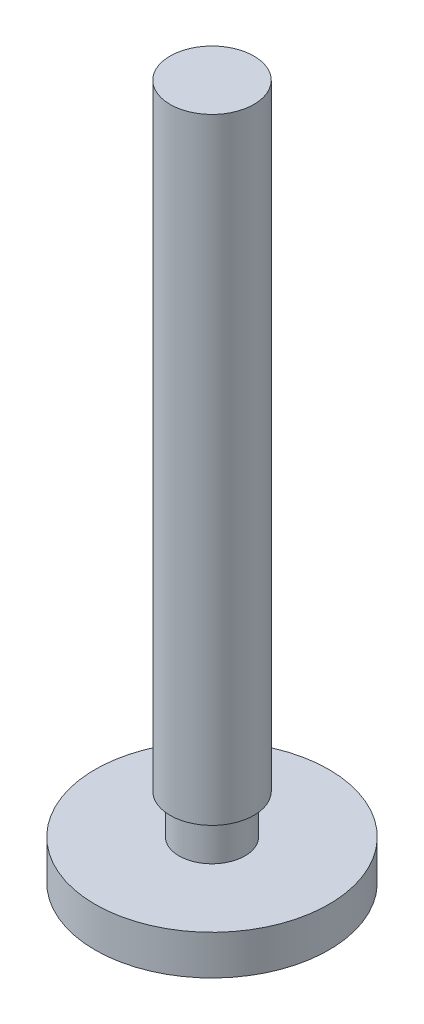
ISO-10303-21;
HEADER;
FILE_DESCRIPTION(('STEP AP214'),'2;1');
FILE_NAME('part.step','',(''),(''),'','','');
FILE_SCHEMA(('AUTOMOTIVE_DESIGN { 1 0 10303 214 1 1 1 1 }'));
ENDSEC;
DATA;
#1=APPLICATION_CONTEXT('core data for automotive mechanical design processes');
#2=APPLICATION_PROTOCOL_DEFINITION('international standard','automotive_design',2000,#1);
#3=PRODUCT_CONTEXT('',#1,'mechanical');
#4=PRODUCT('Part','Part','',(#3));
#5=PRODUCT_RELATED_PRODUCT_CATEGORY('part','',(#4));
#6=PRODUCT_DEFINITION_FORMATION('','',#4);
#7=PRODUCT_DEFINITION_CONTEXT('part definition',#1,'design');
#8=PRODUCT_DEFINITION('design','',#6,#7);
#9=PRODUCT_DEFINITION_SHAPE('','',#8);
#10=(LENGTH_UNIT() NAMED_UNIT(*) SI_UNIT(.MILLI.,.METRE.));
#11=(NAMED_UNIT(*) PLANE_ANGLE_UNIT() SI_UNIT($,.RADIAN.));
#12=(NAMED_UNIT(*) SI_UNIT($,.STERADIAN.) SOLID_ANGLE_UNIT());
#13=UNCERTAINTY_MEASURE_WITH_UNIT(LENGTH_MEASURE(1.E-05),#10,'distance_accuracy_value','');
#14=(GEOMETRIC_REPRESENTATION_CONTEXT(3) GLOBAL_UNCERTAINTY_ASSIGNED_CONTEXT((#13)) GLOBAL_UNIT_ASSIGNED_CONTEXT((#10,
#11,#12)) REPRESENTATION_CONTEXT('',''));
#15=CARTESIAN_POINT('',(0.,0.,0.));
#16=DIRECTION('',(0.,0.,1.));
#17=DIRECTION('',(1.,0.,0.));
#18=AXIS2_PLACEMENT_3D('',#15,#16,#17);
#19=CARTESIAN_POINT('',(0.,2.25,20.));
#20=DIRECTION('',(0.,1.,0.));
#21=DIRECTION('',(0.,0.,1.));
#22=AXIS2_PLACEMENT_3D('',#19,#20,#21);
#23=PLANE('',#22);
#24=CARTESIAN_POINT('',(0.,2.25,10.));
#25=DIRECTION('',(0.,1.,0.));
#26=DIRECTION('',(0.,0.,1.));
#27=AXIS2_PLACEMENT_3D('',#24,#25,#26);
#28=CIRCLE('',#27,3.75);
#29=CARTESIAN_POINT('',(0.,2.25,13.75));
#30=VERTEX_POINT('',#29);
#31=EDGE_CURVE('E10',#30,#30,#28,.T.);
#32=ORIENTED_EDGE('',*,*,#31,.F.);
#33=EDGE_LOOP('',(#32));
#34=FACE_BOUND('',#33,.T.);
#35=CARTESIAN_POINT('',(0.,2.25,10.));
#36=DIRECTION('',(0.,1.,0.));
#37=DIRECTION('',(0.,0.,1.));
#38=AXIS2_PLACEMENT_3D('',#35,#36,#37);
#39=CIRCLE('',#38,13.2876822659183);
#40=CARTESIAN_POINT('',(0.,2.25,23.2876822659183));
#41=VERTEX_POINT('',#40);
#42=EDGE_CURVE('E54',#41,#41,#39,.T.);
#43=ORIENTED_EDGE('',*,*,#42,.T.);
#44=EDGE_LOOP('',(#43));
#45=FACE_BOUND('',#44,.T.);
#46=ADVANCED_FACE('F31',(#34,#45),#23,.T.);
#47=CARTESIAN_POINT('',(0.,6.75,10.));
#48=DIRECTION('',(0.,-1.,0.));
#49=DIRECTION('',(0.,0.,-1.));
#50=AXIS2_PLACEMENT_3D('',#47,#48,#49);
#51=CYLINDRICAL_SURFACE('',#50,3.75);
#52=ORIENTED_EDGE('',*,*,#31,.T.);
#53=EDGE_LOOP('',(#52));
#54=FACE_BOUND('',#53,.T.);
#55=CARTESIAN_POINT('',(0.,6.75,10.));
#56=DIRECTION('',(0.,1.,0.));
#57=DIRECTION('',(0.,0.,1.));
#58=AXIS2_PLACEMENT_3D('',#55,#56,#57);
#59=CIRCLE('',#58,3.75);
#60=CARTESIAN_POINT('',(0.,6.75,13.75));
#61=VERTEX_POINT('',#60);
#62=EDGE_CURVE('E38',#61,#61,#59,.F.);
#63=ORIENTED_EDGE('',*,*,#62,.T.);
#64=EDGE_LOOP('',(#63));
#65=FACE_BOUND('',#64,.T.);
#66=ADVANCED_FACE('F75',(#54,#65),#51,.T.);
#67=CARTESIAN_POINT('',(0.,76.75,10.));
#68=DIRECTION('',(0.,-1.,0.));
#69=DIRECTION('',(0.,0.,-1.));
#70=AXIS2_PLACEMENT_3D('',#67,#68,#69);
#71=CYLINDRICAL_SURFACE('',#70,4.765);
#72=CARTESIAN_POINT('',(0.,76.75,10.));
#73=DIRECTION('',(0.,1.,0.));
#74=DIRECTION('',(0.,0.,1.));
#75=AXIS2_PLACEMENT_3D('',#72,#73,#74);
#76=CIRCLE('',#75,4.765);
#77=CARTESIAN_POINT('',(0.,76.75,14.765));
#78=VERTEX_POINT('',#77);
#79=EDGE_CURVE('E42',#78,#78,#76,.T.);
#80=ORIENTED_EDGE('',*,*,#79,.F.);
#81=EDGE_LOOP('',(#80));
#82=FACE_BOUND('',#81,.T.);
#83=CARTESIAN_POINT('',(0.,6.75,10.));
#84=DIRECTION('',(0.,1.,0.));
#85=DIRECTION('',(0.,0.,1.));
#86=AXIS2_PLACEMENT_3D('',#83,#84,#85);
#87=CIRCLE('',#86,4.765);
#88=CARTESIAN_POINT('',(0.,6.75,14.765));
#89=VERTEX_POINT('',#88);
#90=EDGE_CURVE('E46',#89,#89,#87,.T.);
#91=ORIENTED_EDGE('',*,*,#90,.T.);
#92=EDGE_LOOP('',(#91));
#93=FACE_BOUND('',#92,.T.);
#94=ADVANCED_FACE('F80',(#82,#93),#71,.T.);
#95=CARTESIAN_POINT('',(0.,76.75,10.));
#96=DIRECTION('',(0.,1.,0.));
#97=DIRECTION('',(0.,0.,1.));
#98=AXIS2_PLACEMENT_3D('',#95,#96,#97);
#99=PLANE('',#98);
#100=ORIENTED_EDGE('',*,*,#79,.T.);
#101=EDGE_LOOP('',(#100));
#102=FACE_BOUND('',#101,.T.);
#103=ADVANCED_FACE('F70',(#102),#99,.T.);
#104=CARTESIAN_POINT('',(0.,6.75,10.));
#105=DIRECTION('',(0.,1.,0.));
#106=DIRECTION('',(0.,0.,1.));
#107=AXIS2_PLACEMENT_3D('',#104,#105,#106);
#108=PLANE('',#107);
#109=ORIENTED_EDGE('',*,*,#62,.F.);
#110=EDGE_LOOP('',(#109));
#111=FACE_BOUND('',#110,.T.);
#112=ORIENTED_EDGE('',*,*,#90,.F.);
#113=EDGE_LOOP('',(#112));
#114=FACE_BOUND('',#113,.T.);
#115=ADVANCED_FACE('F61',(#111,#114),#108,.F.);
#116=CARTESIAN_POINT('',(0.,-39.8332409459323,10.));
#117=DIRECTION('',(0.,1.,0.));
#118=DIRECTION('',(0.,0.,1.));
#119=AXIS2_PLACEMENT_3D('',#116,#117,#118);
#120=CYLINDRICAL_SURFACE('',#119,13.2876822659183);
#121=CARTESIAN_POINT('',(0.,-2.25,10.));
#122=DIRECTION('',(0.,1.,0.));
#123=DIRECTION('',(0.,0.,1.));
#124=AXIS2_PLACEMENT_3D('',#121,#122,#123);
#125=CIRCLE('',#124,13.2876822659183);
#126=CARTESIAN_POINT('',(0.,-2.25,23.2876822659183));
#127=VERTEX_POINT('',#126);
#128=EDGE_CURVE('E50',#127,#127,#125,.F.);
#129=ORIENTED_EDGE('',*,*,#128,.F.);
#130=EDGE_LOOP('',(#129));
#131=FACE_BOUND('',#130,.T.);
#132=ORIENTED_EDGE('',*,*,#42,.F.);
#133=EDGE_LOOP('',(#132));
#134=FACE_BOUND('',#133,.T.);
#135=ADVANCED_FACE('F59',(#131,#134),#120,.T.);
#136=CARTESIAN_POINT('',(0.,-2.25,20.));
#137=DIRECTION('',(0.,1.,0.));
#138=DIRECTION('',(0.,0.,1.));
#139=AXIS2_PLACEMENT_3D('',#136,#137,#138);
#140=PLANE('',#139);
#141=ORIENTED_EDGE('',*,*,#128,.T.);
#142=EDGE_LOOP('',(#141));
#143=FACE_BOUND('',#142,.T.);
#144=ADVANCED_FACE('F33',(#143),#140,.F.);
#145=CLOSED_SHELL('',(#46,#66,#94,#103,#115,#135,#144));
#146=MANIFOLD_SOLID_BREP('B2',#145);
#147=ADVANCED_BREP_SHAPE_REPRESENTATION('',(#18,#146),#14);
#148=SHAPE_DEFINITION_REPRESENTATION(#9,#147);
ENDSEC;
END-ISO-10303-21;
